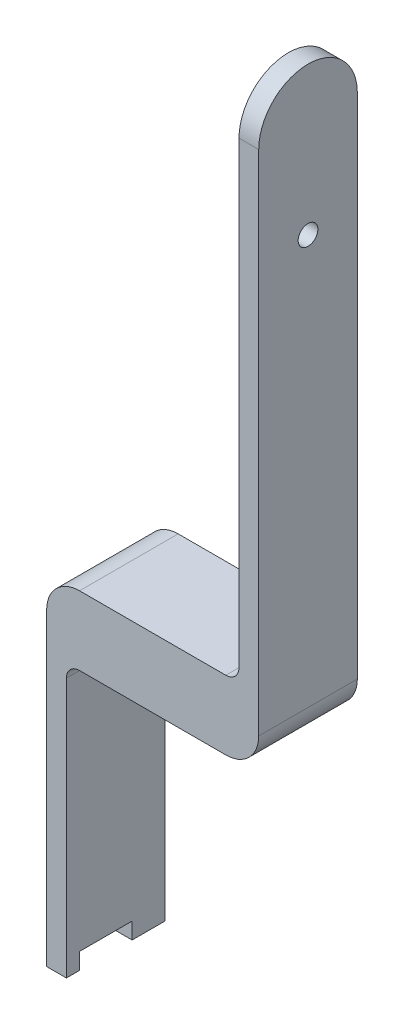
ISO-10303-21;
HEADER;
FILE_DESCRIPTION(('STEP AP214'),'2;1');
FILE_NAME('part.step','',(''),(''),'','','');
FILE_SCHEMA(('AUTOMOTIVE_DESIGN { 1 0 10303 214 1 1 1 1 }'));
ENDSEC;
DATA;
#1=APPLICATION_CONTEXT('core data for automotive mechanical design processes');
#2=APPLICATION_PROTOCOL_DEFINITION('international standard','automotive_design',2000,#1);
#3=PRODUCT_CONTEXT('',#1,'mechanical');
#4=PRODUCT('Part','Part','',(#3));
#5=PRODUCT_RELATED_PRODUCT_CATEGORY('part','',(#4));
#6=PRODUCT_DEFINITION_FORMATION('','',#4);
#7=PRODUCT_DEFINITION_CONTEXT('part definition',#1,'design');
#8=PRODUCT_DEFINITION('design','',#6,#7);
#9=PRODUCT_DEFINITION_SHAPE('','',#8);
#10=(LENGTH_UNIT() NAMED_UNIT(*) SI_UNIT(.MILLI.,.METRE.));
#11=(NAMED_UNIT(*) PLANE_ANGLE_UNIT() SI_UNIT($,.RADIAN.));
#12=(NAMED_UNIT(*) SI_UNIT($,.STERADIAN.) SOLID_ANGLE_UNIT());
#13=UNCERTAINTY_MEASURE_WITH_UNIT(LENGTH_MEASURE(1.E-05),#10,'distance_accuracy_value','');
#14=(GEOMETRIC_REPRESENTATION_CONTEXT(3) GLOBAL_UNCERTAINTY_ASSIGNED_CONTEXT((#13)) GLOBAL_UNIT_ASSIGNED_CONTEXT((#10,
#11,#12)) REPRESENTATION_CONTEXT('',''));
#15=CARTESIAN_POINT('',(0.,0.,0.));
#16=DIRECTION('',(0.,0.,1.));
#17=DIRECTION('',(1.,0.,0.));
#18=AXIS2_PLACEMENT_3D('',#15,#16,#17);
#19=CARTESIAN_POINT('',(-56.12703178483,-41.5022128562179,65.1936710301249));
#20=DIRECTION('',(0.,-1.,0.));
#21=DIRECTION('',(0.,0.,-1.));
#22=AXIS2_PLACEMENT_3D('',#19,#20,#21);
#23=PLANE('',#22);
#24=DIRECTION('',(-1.,0.,0.));
#25=VECTOR('',#24,1.);
#26=CARTESIAN_POINT('',(-23.8759253567212,-41.5022128562179,55.1936710301249));
#27=LINE('',#26,#25);
#28=CARTESIAN_POINT('',(-53.12703178483,-41.5022128562179,55.1936710301249));
#29=VERTEX_POINT('',#28);
#30=CARTESIAN_POINT('',(-56.12703178483,-41.5022128562179,55.1936710301249));
#31=VERTEX_POINT('',#30);
#32=EDGE_CURVE('E147',#29,#31,#27,.T.);
#33=ORIENTED_EDGE('',*,*,#32,.T.);
#34=DIRECTION('',(0.,0.,-1.));
#35=VECTOR('',#34,1.);
#36=CARTESIAN_POINT('',(-56.12703178483,-41.5022128562179,65.1936710301249));
#37=LINE('',#36,#35);
#38=CARTESIAN_POINT('',(-56.12703178483,-41.5022128562179,50.1936710301249));
#39=VERTEX_POINT('',#38);
#40=EDGE_CURVE('E161',#31,#39,#37,.T.);
#41=ORIENTED_EDGE('',*,*,#40,.T.);
#42=DIRECTION('',(1.,0.,0.));
#43=VECTOR('',#42,1.);
#44=CARTESIAN_POINT('',(-56.12703178483,-41.5022128562179,50.1936710301249));
#45=LINE('',#44,#43);
#46=CARTESIAN_POINT('',(-53.12703178483,-41.5022128562179,50.1936710301249));
#47=VERTEX_POINT('',#46);
#48=EDGE_CURVE('E193',#39,#47,#45,.T.);
#49=ORIENTED_EDGE('',*,*,#48,.T.);
#50=DIRECTION('',(0.,0.,1.));
#51=VECTOR('',#50,1.);
#52=CARTESIAN_POINT('',(-53.12703178483,-41.5022128562179,50.1936710301249));
#53=LINE('',#52,#51);
#54=EDGE_CURVE('E164',#47,#29,#53,.T.);
#55=ORIENTED_EDGE('',*,*,#54,.T.);
#56=EDGE_LOOP('',(#33,#41,#49,#55));
#57=FACE_BOUND('',#56,.T.);
#58=ADVANCED_FACE('F33',(#57),#23,.T.);
#59=CARTESIAN_POINT('',(-56.12703178483,82.2511064281089,57.6936710301249));
#60=DIRECTION('',(1.,0.,0.));
#61=DIRECTION('',(0.,0.,-1.));
#62=AXIS2_PLACEMENT_3D('',#59,#60,#61);
#63=CYLINDRICAL_SURFACE('',#62,7.5);
#64=CARTESIAN_POINT('',(-26.8759253567218,82.2511064281089,57.6936710301249));
#65=DIRECTION('',(1.,0.,0.));
#66=DIRECTION('',(0.,0.,-1.));
#67=AXIS2_PLACEMENT_3D('',#64,#65,#66);
#68=CIRCLE('',#67,7.5);
#69=CARTESIAN_POINT('',(-26.8759253567218,82.2511064281089,65.1936710301249));
#70=VERTEX_POINT('',#69);
#71=CARTESIAN_POINT('',(-26.8759253567218,82.2511064281089,50.1936710301249));
#72=VERTEX_POINT('',#71);
#73=EDGE_CURVE('E257',#70,#72,#68,.F.);
#74=ORIENTED_EDGE('',*,*,#73,.F.);
#75=DIRECTION('',(1.,0.,0.));
#76=VECTOR('',#75,1.);
#77=CARTESIAN_POINT('',(-56.12703178483,82.2511064281089,65.1936710301249));
#78=LINE('',#77,#76);
#79=CARTESIAN_POINT('',(-23.8759253567214,82.2511064281089,65.1936710301249));
#80=VERTEX_POINT('',#79);
#81=EDGE_CURVE('E182',#70,#80,#78,.T.);
#82=ORIENTED_EDGE('',*,*,#81,.T.);
#83=CARTESIAN_POINT('',(-23.8759253567214,82.2511064281089,57.6936710301249));
#84=DIRECTION('',(1.,0.,0.));
#85=DIRECTION('',(0.,0.,-1.));
#86=AXIS2_PLACEMENT_3D('',#83,#84,#85);
#87=CIRCLE('',#86,7.5);
#88=CARTESIAN_POINT('',(-23.8759253567214,82.2511064281089,50.1936710301249));
#89=VERTEX_POINT('',#88);
#90=EDGE_CURVE('E183',#89,#80,#87,.T.);
#91=ORIENTED_EDGE('',*,*,#90,.F.);
#92=DIRECTION('',(1.,0.,0.));
#93=VECTOR('',#92,1.);
#94=CARTESIAN_POINT('',(-56.12703178483,82.2511064281089,50.1936710301249));
#95=LINE('',#94,#93);
#96=EDGE_CURVE('E189',#72,#89,#95,.T.);
#97=ORIENTED_EDGE('',*,*,#96,.F.);
#98=EDGE_LOOP('',(#74,#82,#91,#97));
#99=FACE_BOUND('',#98,.T.);
#100=ADVANCED_FACE('F308',(#99),#63,.T.);
#101=CARTESIAN_POINT('',(-56.12703178483,-41.5022128562179,50.1936710301249));
#102=DIRECTION('',(0.,0.,-1.));
#103=DIRECTION('',(-1.,0.,0.));
#104=AXIS2_PLACEMENT_3D('',#101,#102,#103);
#105=PLANE('',#104);
#106=DIRECTION('',(0.,1.,0.));
#107=VECTOR('',#106,1.);
#108=CARTESIAN_POINT('',(-56.12703178483,-41.5022128562179,50.1936710301249));
#109=LINE('',#108,#107);
#110=CARTESIAN_POINT('',(-56.12703178483,5.50000000000009,50.1936710301249));
#111=VERTEX_POINT('',#110);
#112=EDGE_CURVE('E172',#39,#111,#109,.T.);
#113=ORIENTED_EDGE('',*,*,#112,.T.);
#114=CARTESIAN_POINT('',(-51.12703178483,5.5000000000001,50.1936710301249));
#115=DIRECTION('',(0.,0.,-1.));
#116=DIRECTION('',(-1.,0.,0.));
#117=AXIS2_PLACEMENT_3D('',#114,#115,#116);
#118=CIRCLE('',#117,5.);
#119=CARTESIAN_POINT('',(-51.12703178483,10.5000000000001,50.1936710301249));
#120=VERTEX_POINT('',#119);
#121=EDGE_CURVE('E241',#111,#120,#118,.T.);
#122=ORIENTED_EDGE('',*,*,#121,.T.);
#123=DIRECTION('',(1.,0.,0.));
#124=VECTOR('',#123,1.);
#125=CARTESIAN_POINT('',(-56.1270317848305,10.5000000000001,50.1936710301249));
#126=LINE('',#125,#124);
#127=CARTESIAN_POINT('',(-28.8759253567218,10.5000000000001,50.1936710301249));
#128=VERTEX_POINT('',#127);
#129=EDGE_CURVE('E276',#120,#128,#126,.T.);
#130=ORIENTED_EDGE('',*,*,#129,.T.);
#131=CARTESIAN_POINT('',(-28.8759253567218,12.5000000000001,50.1936710301249));
#132=DIRECTION('',(0.,0.,-1.));
#133=DIRECTION('',(-1.,0.,0.));
#134=AXIS2_PLACEMENT_3D('',#131,#132,#133);
#135=CIRCLE('',#134,2.);
#136=CARTESIAN_POINT('',(-26.8759253567218,12.5000000000001,50.1936710301249));
#137=VERTEX_POINT('',#136);
#138=EDGE_CURVE('E229',#128,#137,#135,.F.);
#139=ORIENTED_EDGE('',*,*,#138,.T.);
#140=DIRECTION('',(0.,1.,0.));
#141=VECTOR('',#140,1.);
#142=CARTESIAN_POINT('',(-26.8759253567218,10.5000000000001,50.1936710301249));
#143=LINE('',#142,#141);
#144=EDGE_CURVE('E261',#137,#72,#143,.T.);
#145=ORIENTED_EDGE('',*,*,#144,.T.);
#146=ORIENTED_EDGE('',*,*,#96,.T.);
#147=DIRECTION('',(0.,1.,0.));
#148=VECTOR('',#147,1.);
#149=CARTESIAN_POINT('',(-23.8759253567214,-41.5022128562179,50.1936710301249));
#150=LINE('',#149,#148);
#151=CARTESIAN_POINT('',(-23.8759253567214,4.99999999999998,50.1936710301249));
#152=VERTEX_POINT('',#151);
#153=EDGE_CURVE('E177',#152,#89,#150,.T.);
#154=ORIENTED_EDGE('',*,*,#153,.F.);
#155=CARTESIAN_POINT('',(-28.8759253567215,5.,50.1936710301249));
#156=DIRECTION('',(0.,0.,-1.));
#157=DIRECTION('',(-1.,0.,0.));
#158=AXIS2_PLACEMENT_3D('',#155,#156,#157);
#159=CIRCLE('',#158,5.);
#160=CARTESIAN_POINT('',(-28.8759253567215,0.,50.1936710301249));
#161=VERTEX_POINT('',#160);
#162=EDGE_CURVE('E48',#152,#161,#159,.T.);
#163=ORIENTED_EDGE('',*,*,#162,.T.);
#164=DIRECTION('',(-1.,0.,0.));
#165=VECTOR('',#164,1.);
#166=CARTESIAN_POINT('',(-23.8759253567212,0.,50.1936710301249));
#167=LINE('',#166,#165);
#168=CARTESIAN_POINT('',(-51.1270317848305,0.,50.1936710301249));
#169=VERTEX_POINT('',#168);
#170=EDGE_CURVE('E248',#161,#169,#167,.T.);
#171=ORIENTED_EDGE('',*,*,#170,.T.);
#172=CARTESIAN_POINT('',(-51.1270317848305,-2.,50.1936710301249));
#173=DIRECTION('',(0.,0.,-1.));
#174=DIRECTION('',(-1.,0.,0.));
#175=AXIS2_PLACEMENT_3D('',#172,#173,#174);
#176=CIRCLE('',#175,2.);
#177=CARTESIAN_POINT('',(-53.1270317848305,-2.00000000000002,50.1936710301249));
#178=VERTEX_POINT('',#177);
#179=EDGE_CURVE('E224',#169,#178,#176,.F.);
#180=ORIENTED_EDGE('',*,*,#179,.T.);
#181=DIRECTION('',(0.,-1.,0.));
#182=VECTOR('',#181,1.);
#183=CARTESIAN_POINT('',(-53.1270317848305,0.,50.1936710301249));
#184=LINE('',#183,#182);
#185=EDGE_CURVE('E264',#178,#47,#184,.T.);
#186=ORIENTED_EDGE('',*,*,#185,.T.);
#187=ORIENTED_EDGE('',*,*,#48,.F.);
#188=EDGE_LOOP('',(#113,#122,#130,#139,#145,#146,#154,#163,#171,#180,#186,#187));
#189=FACE_BOUND('',#188,.T.);
#190=ADVANCED_FACE('F314',(#189),#105,.T.);
#191=DIRECTION('',(-1.,0.,0.));
#192=VECTOR('',#191,1.);
#193=CARTESIAN_POINT('',(-23.8759253567212,-41.5022128562179,63.1936710301249));
#194=LINE('',#193,#192);
#195=CARTESIAN_POINT('',(-53.12703178483,-41.5022128562179,63.1936710301249));
#196=VERTEX_POINT('',#195);
#197=CARTESIAN_POINT('',(-56.12703178483,-41.5022128562179,63.1936710301249));
#198=VERTEX_POINT('',#197);
#199=EDGE_CURVE('E165',#196,#198,#194,.T.);
#200=ORIENTED_EDGE('',*,*,#199,.F.);
#201=CARTESIAN_POINT('',(-53.12703178483,-41.5022128562179,65.1936710301249));
#202=VERTEX_POINT('',#201);
#203=EDGE_CURVE('E266',#196,#202,#53,.T.);
#204=ORIENTED_EDGE('',*,*,#203,.T.);
#205=DIRECTION('',(1.,0.,0.));
#206=VECTOR('',#205,1.);
#207=CARTESIAN_POINT('',(-56.12703178483,-41.5022128562179,65.1936710301249));
#208=LINE('',#207,#206);
#209=CARTESIAN_POINT('',(-56.12703178483,-41.5022128562179,65.1936710301249));
#210=VERTEX_POINT('',#209);
#211=EDGE_CURVE('E195',#210,#202,#208,.T.);
#212=ORIENTED_EDGE('',*,*,#211,.F.);
#213=EDGE_CURVE('E173',#210,#198,#37,.T.);
#214=ORIENTED_EDGE('',*,*,#213,.T.);
#215=EDGE_LOOP('',(#200,#204,#212,#214));
#216=FACE_BOUND('',#215,.T.);
#217=ADVANCED_FACE('F310',(#216),#23,.T.);
#218=CARTESIAN_POINT('',(-56.12703178483,82.2511064281089,65.1936710301249));
#219=DIRECTION('',(0.,0.,1.));
#220=DIRECTION('',(0.,-1.,0.));
#221=AXIS2_PLACEMENT_3D('',#218,#219,#220);
#222=PLANE('',#221);
#223=DIRECTION('',(1.,0.,0.));
#224=VECTOR('',#223,1.);
#225=CARTESIAN_POINT('',(-56.1270317848305,10.5000000000001,65.1936710301249));
#226=LINE('',#225,#224);
#227=CARTESIAN_POINT('',(-51.12703178483,10.5000000000001,65.1936710301249));
#228=VERTEX_POINT('',#227);
#229=CARTESIAN_POINT('',(-28.8759253567218,10.5000000000001,65.1936710301249));
#230=VERTEX_POINT('',#229);
#231=EDGE_CURVE('E277',#228,#230,#226,.T.);
#232=ORIENTED_EDGE('',*,*,#231,.F.);
#233=CARTESIAN_POINT('',(-51.12703178483,5.5000000000001,65.1936710301249));
#234=DIRECTION('',(0.,0.,1.));
#235=DIRECTION('',(0.,-1.,0.));
#236=AXIS2_PLACEMENT_3D('',#233,#234,#235);
#237=CIRCLE('',#236,5.);
#238=CARTESIAN_POINT('',(-56.12703178483,5.50000000000013,65.1936710301249));
#239=VERTEX_POINT('',#238);
#240=EDGE_CURVE('E236',#228,#239,#237,.T.);
#241=ORIENTED_EDGE('',*,*,#240,.T.);
#242=DIRECTION('',(0.,-1.,0.));
#243=VECTOR('',#242,1.);
#244=CARTESIAN_POINT('',(-56.12703178483,82.2511064281089,65.1936710301249));
#245=LINE('',#244,#243);
#246=EDGE_CURVE('E174',#239,#210,#245,.T.);
#247=ORIENTED_EDGE('',*,*,#246,.T.);
#248=ORIENTED_EDGE('',*,*,#211,.T.);
#249=DIRECTION('',(0.,-1.,0.));
#250=VECTOR('',#249,1.);
#251=CARTESIAN_POINT('',(-53.1270317848305,0.,65.1936710301249));
#252=LINE('',#251,#250);
#253=CARTESIAN_POINT('',(-53.1270317848305,-2.00000000000002,65.1936710301249));
#254=VERTEX_POINT('',#253);
#255=EDGE_CURVE('E256',#254,#202,#252,.T.);
#256=ORIENTED_EDGE('',*,*,#255,.F.);
#257=CARTESIAN_POINT('',(-51.1270317848305,-2.,65.1936710301249));
#258=DIRECTION('',(0.,0.,1.));
#259=DIRECTION('',(0.,-1.,0.));
#260=AXIS2_PLACEMENT_3D('',#257,#258,#259);
#261=CIRCLE('',#260,2.);
#262=CARTESIAN_POINT('',(-51.1270317848305,0.,65.1936710301249));
#263=VERTEX_POINT('',#262);
#264=EDGE_CURVE('E221',#254,#263,#261,.F.);
#265=ORIENTED_EDGE('',*,*,#264,.T.);
#266=DIRECTION('',(-1.,0.,0.));
#267=VECTOR('',#266,1.);
#268=CARTESIAN_POINT('',(-23.8759253567212,0.,65.1936710301249));
#269=LINE('',#268,#267);
#270=CARTESIAN_POINT('',(-28.8759253567215,0.,65.1936710301249));
#271=VERTEX_POINT('',#270);
#272=EDGE_CURVE('E247',#271,#263,#269,.T.);
#273=ORIENTED_EDGE('',*,*,#272,.F.);
#274=CARTESIAN_POINT('',(-28.8759253567215,5.,65.1936710301249));
#275=DIRECTION('',(0.,0.,1.));
#276=DIRECTION('',(0.,-1.,0.));
#277=AXIS2_PLACEMENT_3D('',#274,#275,#276);
#278=CIRCLE('',#277,5.);
#279=CARTESIAN_POINT('',(-23.8759253567214,5.00000000000003,65.1936710301249));
#280=VERTEX_POINT('',#279);
#281=EDGE_CURVE('E234',#271,#280,#278,.T.);
#282=ORIENTED_EDGE('',*,*,#281,.T.);
#283=DIRECTION('',(0.,-1.,0.));
#284=VECTOR('',#283,1.);
#285=CARTESIAN_POINT('',(-23.8759253567214,82.2511064281089,65.1936710301249));
#286=LINE('',#285,#284);
#287=EDGE_CURVE('E186',#80,#280,#286,.T.);
#288=ORIENTED_EDGE('',*,*,#287,.F.);
#289=ORIENTED_EDGE('',*,*,#81,.F.);
#290=DIRECTION('',(0.,1.,0.));
#291=VECTOR('',#290,1.);
#292=CARTESIAN_POINT('',(-26.8759253567218,10.5000000000001,65.1936710301249));
#293=LINE('',#292,#291);
#294=CARTESIAN_POINT('',(-26.8759253567218,12.5000000000001,65.1936710301249));
#295=VERTEX_POINT('',#294);
#296=EDGE_CURVE('E274',#295,#70,#293,.T.);
#297=ORIENTED_EDGE('',*,*,#296,.F.);
#298=CARTESIAN_POINT('',(-28.8759253567218,12.5000000000001,65.1936710301249));
#299=DIRECTION('',(0.,0.,1.));
#300=DIRECTION('',(0.,-1.,0.));
#301=AXIS2_PLACEMENT_3D('',#298,#299,#300);
#302=CIRCLE('',#301,2.);
#303=EDGE_CURVE('E226',#295,#230,#302,.F.);
#304=ORIENTED_EDGE('',*,*,#303,.T.);
#305=EDGE_LOOP('',(#232,#241,#247,#248,#256,#265,#273,#282,#288,#289,#297,#304));
#306=FACE_BOUND('',#305,.T.);
#307=ADVANCED_FACE('F252',(#306),#222,.T.);
#308=CARTESIAN_POINT('',(-56.12703178483,82.2511064281089,57.6936710301249));
#309=DIRECTION('',(1.,0.,0.));
#310=DIRECTION('',(0.,0.,-1.));
#311=AXIS2_PLACEMENT_3D('',#308,#309,#310);
#312=PLANE('',#311);
#313=ORIENTED_EDGE('',*,*,#246,.F.);
#314=DIRECTION('',(0.,0.,1.));
#315=VECTOR('',#314,1.);
#316=CARTESIAN_POINT('',(-56.12703178483,5.5000000000001,57.6936710301249));
#317=LINE('',#316,#315);
#318=EDGE_CURVE('E238',#239,#111,#317,.F.);
#319=ORIENTED_EDGE('',*,*,#318,.T.);
#320=ORIENTED_EDGE('',*,*,#112,.F.);
#321=ORIENTED_EDGE('',*,*,#40,.F.);
#322=DIRECTION('',(0.,-1.,0.));
#323=VECTOR('',#322,1.);
#324=CARTESIAN_POINT('',(-56.12703178483,-39.0022128562178,55.1936710301249));
#325=LINE('',#324,#323);
#326=CARTESIAN_POINT('',(-56.12703178483,-39.0022128562178,55.1936710301249));
#327=VERTEX_POINT('',#326);
#328=EDGE_CURVE('E144',#327,#31,#325,.T.);
#329=ORIENTED_EDGE('',*,*,#328,.F.);
#330=DIRECTION('',(0.,0.,-1.));
#331=VECTOR('',#330,1.);
#332=CARTESIAN_POINT('',(-56.12703178483,-39.0022128562178,63.1936710301249));
#333=LINE('',#332,#331);
#334=CARTESIAN_POINT('',(-56.12703178483,-39.0022128562178,63.1936710301249));
#335=VERTEX_POINT('',#334);
#336=EDGE_CURVE('E166',#335,#327,#333,.T.);
#337=ORIENTED_EDGE('',*,*,#336,.F.);
#338=DIRECTION('',(0.,1.,0.));
#339=VECTOR('',#338,1.);
#340=CARTESIAN_POINT('',(-56.12703178483,-41.5022128562179,63.1936710301249));
#341=LINE('',#340,#339);
#342=EDGE_CURVE('E155',#198,#335,#341,.T.);
#343=ORIENTED_EDGE('',*,*,#342,.F.);
#344=ORIENTED_EDGE('',*,*,#213,.F.);
#345=EDGE_LOOP('',(#313,#319,#320,#321,#329,#337,#343,#344));
#346=FACE_BOUND('',#345,.T.);
#347=ADVANCED_FACE('F170',(#346),#312,.F.);
#348=CARTESIAN_POINT('',(-23.8759253567214,82.2511064281089,57.6936710301249));
#349=DIRECTION('',(1.,0.,0.));
#350=DIRECTION('',(0.,0.,-1.));
#351=AXIS2_PLACEMENT_3D('',#348,#349,#350);
#352=PLANE('',#351);
#353=CARTESIAN_POINT('',(-23.8759253567214,67.2511064281089,57.6936710301249));
#354=DIRECTION('',(1.,0.,0.));
#355=DIRECTION('',(0.,0.,-1.));
#356=AXIS2_PLACEMENT_3D('',#353,#354,#355);
#357=CIRCLE('',#356,1.49999999999997);
#358=CARTESIAN_POINT('',(-23.8759253567214,67.2511064281089,56.1936710301249));
#359=VERTEX_POINT('',#358);
#360=EDGE_CURVE('E209',#359,#359,#357,.T.);
#361=ORIENTED_EDGE('',*,*,#360,.F.);
#362=EDGE_LOOP('',(#361));
#363=FACE_BOUND('',#362,.T.);
#364=ORIENTED_EDGE('',*,*,#287,.T.);
#365=DIRECTION('',(0.,0.,1.));
#366=VECTOR('',#365,1.);
#367=CARTESIAN_POINT('',(-23.8759253567214,5.,50.1936710301249));
#368=LINE('',#367,#366);
#369=EDGE_CURVE('E11',#280,#152,#368,.F.);
#370=ORIENTED_EDGE('',*,*,#369,.T.);
#371=ORIENTED_EDGE('',*,*,#153,.T.);
#372=ORIENTED_EDGE('',*,*,#90,.T.);
#373=EDGE_LOOP('',(#364,#370,#371,#372));
#374=FACE_BOUND('',#373,.T.);
#375=ADVANCED_FACE('F294',(#363,#374),#352,.T.);
#376=CARTESIAN_POINT('',(-53.1270317848305,0.,50.1936710301249));
#377=DIRECTION('',(-1.,0.,0.));
#378=DIRECTION('',(0.,-1.,0.));
#379=AXIS2_PLACEMENT_3D('',#376,#377,#378);
#380=PLANE('',#379);
#381=ORIENTED_EDGE('',*,*,#185,.F.);
#382=DIRECTION('',(0.,0.,1.));
#383=VECTOR('',#382,1.);
#384=CARTESIAN_POINT('',(-53.1270317848305,-2.00000000000002,65.1936710301249));
#385=LINE('',#384,#383);
#386=EDGE_CURVE('E206',#178,#254,#385,.T.);
#387=ORIENTED_EDGE('',*,*,#386,.T.);
#388=ORIENTED_EDGE('',*,*,#255,.T.);
#389=ORIENTED_EDGE('',*,*,#203,.F.);
#390=DIRECTION('',(0.,1.,0.));
#391=VECTOR('',#390,1.);
#392=CARTESIAN_POINT('',(-53.1270317848305,0.,63.1936710301249));
#393=LINE('',#392,#391);
#394=CARTESIAN_POINT('',(-53.12703178483,-39.0022128562178,63.1936710301249));
#395=VERTEX_POINT('',#394);
#396=EDGE_CURVE('E192',#196,#395,#393,.T.);
#397=ORIENTED_EDGE('',*,*,#396,.T.);
#398=DIRECTION('',(0.,0.,-1.));
#399=VECTOR('',#398,1.);
#400=CARTESIAN_POINT('',(-53.12703178483,-39.0022128562178,50.1936710301249));
#401=LINE('',#400,#399);
#402=CARTESIAN_POINT('',(-53.12703178483,-39.0022128562178,55.1936710301249));
#403=VERTEX_POINT('',#402);
#404=EDGE_CURVE('E201',#395,#403,#401,.T.);
#405=ORIENTED_EDGE('',*,*,#404,.T.);
#406=DIRECTION('',(0.,-1.,0.));
#407=VECTOR('',#406,1.);
#408=CARTESIAN_POINT('',(-53.1270317848305,0.,55.1936710301249));
#409=LINE('',#408,#407);
#410=EDGE_CURVE('E204',#403,#29,#409,.T.);
#411=ORIENTED_EDGE('',*,*,#410,.T.);
#412=ORIENTED_EDGE('',*,*,#54,.F.);
#413=EDGE_LOOP('',(#381,#387,#388,#389,#397,#405,#411,#412));
#414=FACE_BOUND('',#413,.T.);
#415=ADVANCED_FACE('F296',(#414),#380,.F.);
#416=CARTESIAN_POINT('',(-23.8759253567212,0.,50.1936710301249));
#417=DIRECTION('',(0.,1.,0.));
#418=DIRECTION('',(0.,0.,1.));
#419=AXIS2_PLACEMENT_3D('',#416,#417,#418);
#420=PLANE('',#419);
#421=ORIENTED_EDGE('',*,*,#170,.F.);
#422=DIRECTION('',(0.,0.,1.));
#423=VECTOR('',#422,1.);
#424=CARTESIAN_POINT('',(-28.8759253567215,0.,65.1936710301249));
#425=LINE('',#424,#423);
#426=EDGE_CURVE('E41',#161,#271,#425,.T.);
#427=ORIENTED_EDGE('',*,*,#426,.T.);
#428=ORIENTED_EDGE('',*,*,#272,.T.);
#429=DIRECTION('',(0.,0.,1.));
#430=VECTOR('',#429,1.);
#431=CARTESIAN_POINT('',(-51.1270317848305,0.,50.1936710301249));
#432=LINE('',#431,#430);
#433=EDGE_CURVE('E212',#263,#169,#432,.F.);
#434=ORIENTED_EDGE('',*,*,#433,.T.);
#435=EDGE_LOOP('',(#421,#427,#428,#434));
#436=FACE_BOUND('',#435,.T.);
#437=ADVANCED_FACE('F246',(#436),#420,.F.);
#438=CARTESIAN_POINT('',(-26.8759253567218,10.5000000000001,50.1936710301249));
#439=DIRECTION('',(1.,0.,0.));
#440=DIRECTION('',(0.,0.,-1.));
#441=AXIS2_PLACEMENT_3D('',#438,#439,#440);
#442=PLANE('',#441);
#443=CARTESIAN_POINT('',(-26.8759253567218,67.2511064281089,57.6936710301249));
#444=DIRECTION('',(1.,0.,0.));
#445=DIRECTION('',(0.,0.,-1.));
#446=AXIS2_PLACEMENT_3D('',#443,#444,#445);
#447=CIRCLE('',#446,1.49999999999997);
#448=CARTESIAN_POINT('',(-26.8759253567218,67.2511064281089,56.1936710301249));
#449=VERTEX_POINT('',#448);
#450=EDGE_CURVE('E156',#449,#449,#447,.T.);
#451=ORIENTED_EDGE('',*,*,#450,.T.);
#452=EDGE_LOOP('',(#451));
#453=FACE_BOUND('',#452,.T.);
#454=ORIENTED_EDGE('',*,*,#144,.F.);
#455=DIRECTION('',(0.,0.,1.));
#456=VECTOR('',#455,1.);
#457=CARTESIAN_POINT('',(-26.8759253567218,12.5000000000001,65.1936710301249));
#458=LINE('',#457,#456);
#459=EDGE_CURVE('E215',#137,#295,#458,.T.);
#460=ORIENTED_EDGE('',*,*,#459,.T.);
#461=ORIENTED_EDGE('',*,*,#296,.T.);
#462=ORIENTED_EDGE('',*,*,#73,.T.);
#463=EDGE_LOOP('',(#454,#460,#461,#462));
#464=FACE_BOUND('',#463,.T.);
#465=ADVANCED_FACE('F346',(#453,#464),#442,.F.);
#466=CARTESIAN_POINT('',(-56.1270317848305,10.5000000000001,50.1936710301249));
#467=DIRECTION('',(0.,-1.,0.));
#468=DIRECTION('',(0.,0.,-1.));
#469=AXIS2_PLACEMENT_3D('',#466,#467,#468);
#470=PLANE('',#469);
#471=ORIENTED_EDGE('',*,*,#129,.F.);
#472=DIRECTION('',(0.,0.,1.));
#473=VECTOR('',#472,1.);
#474=CARTESIAN_POINT('',(-51.12703178483,10.5000000000001,50.1936710301249));
#475=LINE('',#474,#473);
#476=EDGE_CURVE('E231',#120,#228,#475,.T.);
#477=ORIENTED_EDGE('',*,*,#476,.T.);
#478=ORIENTED_EDGE('',*,*,#231,.T.);
#479=DIRECTION('',(0.,0.,1.));
#480=VECTOR('',#479,1.);
#481=CARTESIAN_POINT('',(-28.8759253567218,10.5000000000001,50.1936710301249));
#482=LINE('',#481,#480);
#483=EDGE_CURVE('E218',#230,#128,#482,.F.);
#484=ORIENTED_EDGE('',*,*,#483,.T.);
#485=EDGE_LOOP('',(#471,#477,#478,#484));
#486=FACE_BOUND('',#485,.T.);
#487=ADVANCED_FACE('F338',(#486),#470,.F.);
#488=CARTESIAN_POINT('',(-23.8759253567212,-39.0022128562178,55.1936710301249));
#489=DIRECTION('',(0.,0.,-1.));
#490=DIRECTION('',(-1.,0.,0.));
#491=AXIS2_PLACEMENT_3D('',#488,#489,#490);
#492=PLANE('',#491);
#493=DIRECTION('',(-1.,0.,0.));
#494=VECTOR('',#493,1.);
#495=CARTESIAN_POINT('',(-23.8759253567212,-39.0022128562178,55.1936710301249));
#496=LINE('',#495,#494);
#497=EDGE_CURVE('E150',#403,#327,#496,.T.);
#498=ORIENTED_EDGE('',*,*,#497,.T.);
#499=ORIENTED_EDGE('',*,*,#328,.T.);
#500=ORIENTED_EDGE('',*,*,#32,.F.);
#501=ORIENTED_EDGE('',*,*,#410,.F.);
#502=EDGE_LOOP('',(#498,#499,#500,#501));
#503=FACE_BOUND('',#502,.T.);
#504=ADVANCED_FACE('F146',(#503),#492,.F.);
#505=CARTESIAN_POINT('',(-23.8759253567212,-39.0022128562178,63.1936710301249));
#506=DIRECTION('',(0.,1.,0.));
#507=DIRECTION('',(0.,0.,1.));
#508=AXIS2_PLACEMENT_3D('',#505,#506,#507);
#509=PLANE('',#508);
#510=DIRECTION('',(-1.,0.,0.));
#511=VECTOR('',#510,1.);
#512=CARTESIAN_POINT('',(-23.8759253567212,-39.0022128562178,63.1936710301249));
#513=LINE('',#512,#511);
#514=EDGE_CURVE('E282',#395,#335,#513,.T.);
#515=ORIENTED_EDGE('',*,*,#514,.T.);
#516=ORIENTED_EDGE('',*,*,#336,.T.);
#517=ORIENTED_EDGE('',*,*,#497,.F.);
#518=ORIENTED_EDGE('',*,*,#404,.F.);
#519=EDGE_LOOP('',(#515,#516,#517,#518));
#520=FACE_BOUND('',#519,.T.);
#521=ADVANCED_FACE('F333',(#520),#509,.F.);
#522=CARTESIAN_POINT('',(-23.8759253567212,-41.5022128562179,63.1936710301249));
#523=DIRECTION('',(0.,0.,1.));
#524=DIRECTION('',(1.,0.,0.));
#525=AXIS2_PLACEMENT_3D('',#522,#523,#524);
#526=PLANE('',#525);
#527=ORIENTED_EDGE('',*,*,#199,.T.);
#528=ORIENTED_EDGE('',*,*,#342,.T.);
#529=ORIENTED_EDGE('',*,*,#514,.F.);
#530=ORIENTED_EDGE('',*,*,#396,.F.);
#531=EDGE_LOOP('',(#527,#528,#529,#530));
#532=FACE_BOUND('',#531,.T.);
#533=ADVANCED_FACE('F330',(#532),#526,.F.);
#534=CARTESIAN_POINT('',(-23.8759253567214,67.2511064281089,57.6936710301249));
#535=DIRECTION('',(1.,0.,0.));
#536=DIRECTION('',(0.,0.,-1.));
#537=AXIS2_PLACEMENT_3D('',#534,#535,#536);
#538=CYLINDRICAL_SURFACE('',#537,1.49999999999997);
#539=ORIENTED_EDGE('',*,*,#360,.T.);
#540=EDGE_LOOP('',(#539));
#541=FACE_BOUND('',#540,.T.);
#542=ORIENTED_EDGE('',*,*,#450,.F.);
#543=EDGE_LOOP('',(#542));
#544=FACE_BOUND('',#543,.T.);
#545=ADVANCED_FACE('F291',(#541,#544),#538,.F.);
#546=CARTESIAN_POINT('',(-51.1270317848305,-2.,50.1936710301249));
#547=DIRECTION('',(0.,0.,-1.));
#548=DIRECTION('',(-1.,0.,0.));
#549=AXIS2_PLACEMENT_3D('',#546,#547,#548);
#550=CYLINDRICAL_SURFACE('',#549,2.);
#551=ORIENTED_EDGE('',*,*,#179,.F.);
#552=ORIENTED_EDGE('',*,*,#433,.F.);
#553=ORIENTED_EDGE('',*,*,#264,.F.);
#554=ORIENTED_EDGE('',*,*,#386,.F.);
#555=EDGE_LOOP('',(#551,#552,#553,#554));
#556=FACE_BOUND('',#555,.T.);
#557=ADVANCED_FACE('F409',(#556),#550,.F.);
#558=CARTESIAN_POINT('',(-28.8759253567218,12.5000000000001,50.1936710301249));
#559=DIRECTION('',(0.,0.,-1.));
#560=DIRECTION('',(-1.,0.,0.));
#561=AXIS2_PLACEMENT_3D('',#558,#559,#560);
#562=CYLINDRICAL_SURFACE('',#561,2.);
#563=ORIENTED_EDGE('',*,*,#138,.F.);
#564=ORIENTED_EDGE('',*,*,#483,.F.);
#565=ORIENTED_EDGE('',*,*,#303,.F.);
#566=ORIENTED_EDGE('',*,*,#459,.F.);
#567=EDGE_LOOP('',(#563,#564,#565,#566));
#568=FACE_BOUND('',#567,.T.);
#569=ADVANCED_FACE('F305',(#568),#562,.F.);
#570=CARTESIAN_POINT('',(-51.12703178483,5.5000000000001,50.1936710301249));
#571=DIRECTION('',(0.,0.,1.));
#572=DIRECTION('',(1.,0.,0.));
#573=AXIS2_PLACEMENT_3D('',#570,#571,#572);
#574=CYLINDRICAL_SURFACE('',#573,5.);
#575=ORIENTED_EDGE('',*,*,#121,.F.);
#576=ORIENTED_EDGE('',*,*,#318,.F.);
#577=ORIENTED_EDGE('',*,*,#240,.F.);
#578=ORIENTED_EDGE('',*,*,#476,.F.);
#579=EDGE_LOOP('',(#575,#576,#577,#578));
#580=FACE_BOUND('',#579,.T.);
#581=ADVANCED_FACE('F301',(#580),#574,.T.);
#582=CARTESIAN_POINT('',(-28.8759253567215,5.,50.1936710301249));
#583=DIRECTION('',(0.,0.,-1.));
#584=DIRECTION('',(-1.,0.,0.));
#585=AXIS2_PLACEMENT_3D('',#582,#583,#584);
#586=CYLINDRICAL_SURFACE('',#585,5.);
#587=ORIENTED_EDGE('',*,*,#162,.F.);
#588=ORIENTED_EDGE('',*,*,#369,.F.);
#589=ORIENTED_EDGE('',*,*,#281,.F.);
#590=ORIENTED_EDGE('',*,*,#426,.F.);
#591=EDGE_LOOP('',(#587,#588,#589,#590));
#592=FACE_BOUND('',#591,.T.);
#593=ADVANCED_FACE('F35',(#592),#586,.T.);
#594=CLOSED_SHELL('',(#58,#100,#190,#217,#307,#347,#375,#415,#437,#465,#487,#504,#521,#533,#545,
#557,#569,#581,#593));
#595=MANIFOLD_SOLID_BREP('B2',#594);
#596=ADVANCED_BREP_SHAPE_REPRESENTATION('',(#18,#595),#14);
#597=SHAPE_DEFINITION_REPRESENTATION(#9,#596);
ENDSEC;
END-ISO-10303-21;
